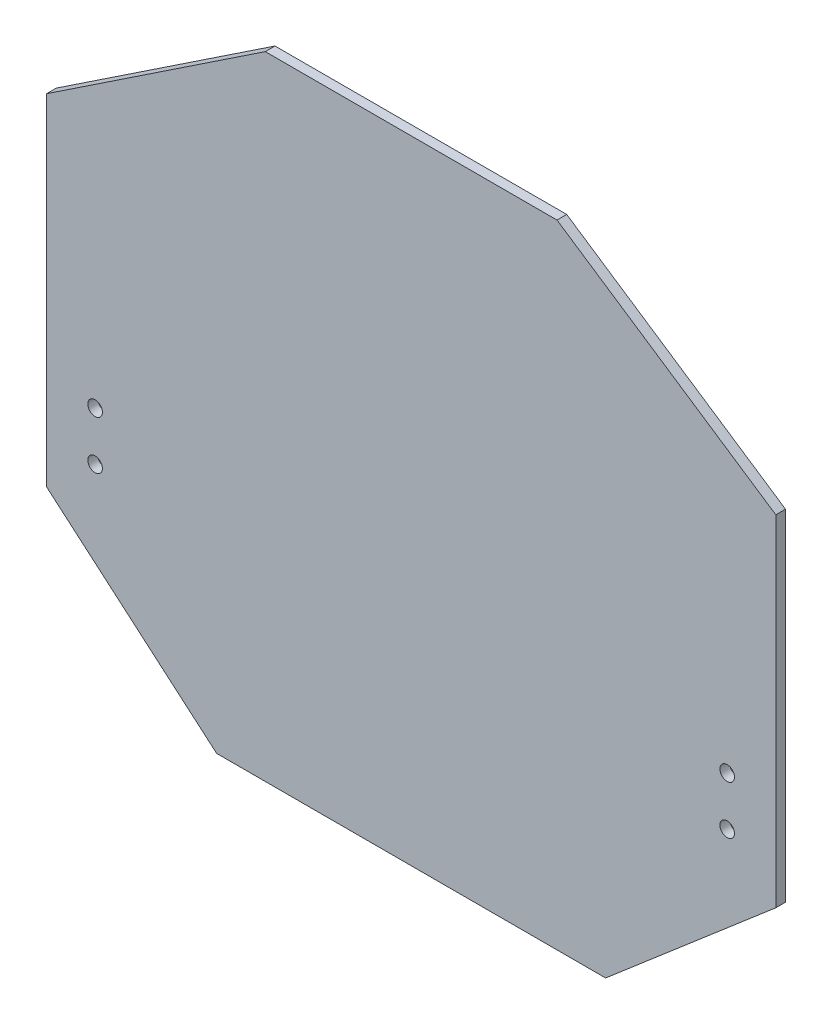
ISO-10303-21;
HEADER;
FILE_DESCRIPTION(('STEP AP214'),'2;1');
FILE_NAME('part.step','',(''),(''),'','','');
FILE_SCHEMA(('AUTOMOTIVE_DESIGN { 1 0 10303 214 1 1 1 1 }'));
ENDSEC;
DATA;
#1=APPLICATION_CONTEXT('core data for automotive mechanical design processes');
#2=APPLICATION_PROTOCOL_DEFINITION('international standard','automotive_design',2000,#1);
#3=PRODUCT_CONTEXT('',#1,'mechanical');
#4=PRODUCT('Part','Part','',(#3));
#5=PRODUCT_RELATED_PRODUCT_CATEGORY('part','',(#4));
#6=PRODUCT_DEFINITION_FORMATION('','',#4);
#7=PRODUCT_DEFINITION_CONTEXT('part definition',#1,'design');
#8=PRODUCT_DEFINITION('design','',#6,#7);
#9=PRODUCT_DEFINITION_SHAPE('','',#8);
#10=(LENGTH_UNIT() NAMED_UNIT(*) SI_UNIT(.MILLI.,.METRE.));
#11=(NAMED_UNIT(*) PLANE_ANGLE_UNIT() SI_UNIT($,.RADIAN.));
#12=(NAMED_UNIT(*) SI_UNIT($,.STERADIAN.) SOLID_ANGLE_UNIT());
#13=UNCERTAINTY_MEASURE_WITH_UNIT(LENGTH_MEASURE(1.E-05),#10,'distance_accuracy_value','');
#14=(GEOMETRIC_REPRESENTATION_CONTEXT(3) GLOBAL_UNCERTAINTY_ASSIGNED_CONTEXT((#13)) GLOBAL_UNIT_ASSIGNED_CONTEXT((#10,
#11,#12)) REPRESENTATION_CONTEXT('',''));
#15=CARTESIAN_POINT('',(0.,0.,0.));
#16=DIRECTION('',(0.,0.,1.));
#17=DIRECTION('',(1.,0.,0.));
#18=AXIS2_PLACEMENT_3D('',#15,#16,#17);
#19=CARTESIAN_POINT('',(0.,0.,2.));
#20=DIRECTION('',(0.,0.,-1.));
#21=DIRECTION('',(-1.,0.,0.));
#22=AXIS2_PLACEMENT_3D('',#19,#20,#21);
#23=PLANE('',#22);
#24=DIRECTION('',(0.759256602365296,-0.650791373455969,0.));
#25=VECTOR('',#24,1.);
#26=CARTESIAN_POINT('',(-75.,0.,2.));
#27=LINE('',#26,#25);
#28=CARTESIAN_POINT('',(-75.,0.,2.));
#29=VERTEX_POINT('',#28);
#30=CARTESIAN_POINT('',(-40.,-30.,2.));
#31=VERTEX_POINT('',#30);
#32=EDGE_CURVE('E153',#29,#31,#27,.T.);
#33=ORIENTED_EDGE('',*,*,#32,.T.);
#34=DIRECTION('',(1.,0.,0.));
#35=VECTOR('',#34,1.);
#36=CARTESIAN_POINT('',(-40.,-30.,2.));
#37=LINE('',#36,#35);
#38=CARTESIAN_POINT('',(40.,-30.,2.));
#39=VERTEX_POINT('',#38);
#40=EDGE_CURVE('E101',#31,#39,#37,.T.);
#41=ORIENTED_EDGE('',*,*,#40,.T.);
#42=DIRECTION('',(0.759256602365296,0.650791373455969,0.));
#43=VECTOR('',#42,1.);
#44=CARTESIAN_POINT('',(75.,0.,2.));
#45=LINE('',#44,#43);
#46=CARTESIAN_POINT('',(75.,0.,2.));
#47=VERTEX_POINT('',#46);
#48=EDGE_CURVE('E168',#39,#47,#45,.T.);
#49=ORIENTED_EDGE('',*,*,#48,.T.);
#50=DIRECTION('',(0.,1.,0.));
#51=VECTOR('',#50,1.);
#52=CARTESIAN_POINT('',(75.,0.,2.));
#53=LINE('',#52,#51);
#54=CARTESIAN_POINT('',(75.,70.,2.));
#55=VERTEX_POINT('',#54);
#56=EDGE_CURVE('E181',#47,#55,#53,.T.);
#57=ORIENTED_EDGE('',*,*,#56,.T.);
#58=DIRECTION('',(-0.832050294337844,0.554700196225229,0.));
#59=VECTOR('',#58,1.);
#60=CARTESIAN_POINT('',(75.,70.,2.));
#61=LINE('',#60,#59);
#62=CARTESIAN_POINT('',(30.,100.,2.));
#63=VERTEX_POINT('',#62);
#64=EDGE_CURVE('E120',#55,#63,#61,.T.);
#65=ORIENTED_EDGE('',*,*,#64,.T.);
#66=DIRECTION('',(-1.,0.,0.));
#67=VECTOR('',#66,1.);
#68=CARTESIAN_POINT('',(-30.,100.,2.));
#69=LINE('',#68,#67);
#70=CARTESIAN_POINT('',(-30.,100.,2.));
#71=VERTEX_POINT('',#70);
#72=EDGE_CURVE('E114',#63,#71,#69,.T.);
#73=ORIENTED_EDGE('',*,*,#72,.T.);
#74=DIRECTION('',(-0.832050294337844,-0.554700196225229,0.));
#75=VECTOR('',#74,1.);
#76=CARTESIAN_POINT('',(-75.,70.,2.));
#77=LINE('',#76,#75);
#78=CARTESIAN_POINT('',(-75.,70.,2.));
#79=VERTEX_POINT('',#78);
#80=EDGE_CURVE('E118',#71,#79,#77,.T.);
#81=ORIENTED_EDGE('',*,*,#80,.T.);
#82=DIRECTION('',(0.,-1.,0.));
#83=VECTOR('',#82,1.);
#84=CARTESIAN_POINT('',(-75.,0.,2.));
#85=LINE('',#84,#83);
#86=EDGE_CURVE('E58',#79,#29,#85,.T.);
#87=ORIENTED_EDGE('',*,*,#86,.T.);
#88=EDGE_LOOP('',(#33,#41,#49,#57,#65,#73,#81,#87));
#89=FACE_BOUND('',#88,.T.);
#90=CARTESIAN_POINT('',(-65.,9.,2.));
#91=DIRECTION('',(0.,0.,1.));
#92=DIRECTION('',(1.,0.,0.));
#93=AXIS2_PLACEMENT_3D('',#90,#91,#92);
#94=CIRCLE('',#93,1.5);
#95=CARTESIAN_POINT('',(-63.5,9.,2.));
#96=VERTEX_POINT('',#95);
#97=EDGE_CURVE('E142',#96,#96,#94,.T.);
#98=ORIENTED_EDGE('',*,*,#97,.F.);
#99=EDGE_LOOP('',(#98));
#100=FACE_BOUND('',#99,.T.);
#101=CARTESIAN_POINT('',(-65.,19.,2.));
#102=DIRECTION('',(0.,0.,1.));
#103=DIRECTION('',(1.,0.,0.));
#104=AXIS2_PLACEMENT_3D('',#101,#102,#103);
#105=CIRCLE('',#104,1.5);
#106=CARTESIAN_POINT('',(-63.5,19.,2.));
#107=VERTEX_POINT('',#106);
#108=EDGE_CURVE('E190',#107,#107,#105,.T.);
#109=ORIENTED_EDGE('',*,*,#108,.F.);
#110=EDGE_LOOP('',(#109));
#111=FACE_BOUND('',#110,.T.);
#112=CARTESIAN_POINT('',(65.,19.,2.));
#113=DIRECTION('',(0.,0.,1.));
#114=DIRECTION('',(-1.,0.,0.));
#115=AXIS2_PLACEMENT_3D('',#112,#113,#114);
#116=CIRCLE('',#115,1.5);
#117=CARTESIAN_POINT('',(63.5,19.,2.));
#118=VERTEX_POINT('',#117);
#119=EDGE_CURVE('E196',#118,#118,#116,.T.);
#120=ORIENTED_EDGE('',*,*,#119,.F.);
#121=EDGE_LOOP('',(#120));
#122=FACE_BOUND('',#121,.T.);
#123=CARTESIAN_POINT('',(65.,9.,2.));
#124=DIRECTION('',(0.,0.,1.));
#125=DIRECTION('',(-1.,0.,0.));
#126=AXIS2_PLACEMENT_3D('',#123,#124,#125);
#127=CIRCLE('',#126,1.5);
#128=CARTESIAN_POINT('',(63.5,9.,2.));
#129=VERTEX_POINT('',#128);
#130=EDGE_CURVE('E202',#129,#129,#127,.T.);
#131=ORIENTED_EDGE('',*,*,#130,.F.);
#132=EDGE_LOOP('',(#131));
#133=FACE_BOUND('',#132,.T.);
#134=ADVANCED_FACE('F41',(#89,#100,#111,#122,#133),#23,.F.);
#135=CARTESIAN_POINT('',(0.,0.,0.));
#136=DIRECTION('',(0.,0.,-1.));
#137=DIRECTION('',(-1.,0.,0.));
#138=AXIS2_PLACEMENT_3D('',#135,#136,#137);
#139=PLANE('',#138);
#140=CARTESIAN_POINT('',(65.,19.,0.));
#141=DIRECTION('',(0.,0.,1.));
#142=DIRECTION('',(-1.,0.,0.));
#143=AXIS2_PLACEMENT_3D('',#140,#141,#142);
#144=CIRCLE('',#143,1.5);
#145=CARTESIAN_POINT('',(63.5,19.,0.));
#146=VERTEX_POINT('',#145);
#147=EDGE_CURVE('E199',#146,#146,#144,.T.);
#148=ORIENTED_EDGE('',*,*,#147,.T.);
#149=EDGE_LOOP('',(#148));
#150=FACE_BOUND('',#149,.T.);
#151=CARTESIAN_POINT('',(-65.,9.,0.));
#152=DIRECTION('',(0.,0.,1.));
#153=DIRECTION('',(1.,0.,0.));
#154=AXIS2_PLACEMENT_3D('',#151,#152,#153);
#155=CIRCLE('',#154,1.5);
#156=CARTESIAN_POINT('',(-63.5,9.,0.));
#157=VERTEX_POINT('',#156);
#158=EDGE_CURVE('E187',#157,#157,#155,.T.);
#159=ORIENTED_EDGE('',*,*,#158,.T.);
#160=EDGE_LOOP('',(#159));
#161=FACE_BOUND('',#160,.T.);
#162=DIRECTION('',(0.759256602365296,-0.650791373455969,0.));
#163=VECTOR('',#162,1.);
#164=CARTESIAN_POINT('',(-75.,0.,0.));
#165=LINE('',#164,#163);
#166=CARTESIAN_POINT('',(-75.,0.,0.));
#167=VERTEX_POINT('',#166);
#168=CARTESIAN_POINT('',(-40.,-30.,0.));
#169=VERTEX_POINT('',#168);
#170=EDGE_CURVE('E138',#167,#169,#165,.T.);
#171=ORIENTED_EDGE('',*,*,#170,.F.);
#172=DIRECTION('',(0.,-1.,0.));
#173=VECTOR('',#172,1.);
#174=CARTESIAN_POINT('',(-75.,0.,0.));
#175=LINE('',#174,#173);
#176=CARTESIAN_POINT('',(-75.,70.,0.));
#177=VERTEX_POINT('',#176);
#178=EDGE_CURVE('E93',#177,#167,#175,.T.);
#179=ORIENTED_EDGE('',*,*,#178,.F.);
#180=DIRECTION('',(-0.832050294337844,-0.554700196225229,0.));
#181=VECTOR('',#180,1.);
#182=CARTESIAN_POINT('',(-75.,70.,0.));
#183=LINE('',#182,#181);
#184=CARTESIAN_POINT('',(-30.,100.,0.));
#185=VERTEX_POINT('',#184);
#186=EDGE_CURVE('E87',#185,#177,#183,.T.);
#187=ORIENTED_EDGE('',*,*,#186,.F.);
#188=DIRECTION('',(-1.,0.,0.));
#189=VECTOR('',#188,1.);
#190=CARTESIAN_POINT('',(-30.,100.,0.));
#191=LINE('',#190,#189);
#192=CARTESIAN_POINT('',(30.,100.,0.));
#193=VERTEX_POINT('',#192);
#194=EDGE_CURVE('E128',#193,#185,#191,.T.);
#195=ORIENTED_EDGE('',*,*,#194,.F.);
#196=DIRECTION('',(-0.832050294337844,0.554700196225229,0.));
#197=VECTOR('',#196,1.);
#198=CARTESIAN_POINT('',(75.,70.,0.));
#199=LINE('',#198,#197);
#200=CARTESIAN_POINT('',(75.,70.,0.));
#201=VERTEX_POINT('',#200);
#202=EDGE_CURVE('E148',#201,#193,#199,.T.);
#203=ORIENTED_EDGE('',*,*,#202,.F.);
#204=DIRECTION('',(0.,1.,0.));
#205=VECTOR('',#204,1.);
#206=CARTESIAN_POINT('',(75.,0.,0.));
#207=LINE('',#206,#205);
#208=CARTESIAN_POINT('',(75.,0.,0.));
#209=VERTEX_POINT('',#208);
#210=EDGE_CURVE('E146',#209,#201,#207,.T.);
#211=ORIENTED_EDGE('',*,*,#210,.F.);
#212=DIRECTION('',(0.759256602365296,0.650791373455969,0.));
#213=VECTOR('',#212,1.);
#214=CARTESIAN_POINT('',(75.,0.,0.));
#215=LINE('',#214,#213);
#216=CARTESIAN_POINT('',(40.,-30.,0.));
#217=VERTEX_POINT('',#216);
#218=EDGE_CURVE('E144',#217,#209,#215,.T.);
#219=ORIENTED_EDGE('',*,*,#218,.F.);
#220=DIRECTION('',(1.,0.,0.));
#221=VECTOR('',#220,1.);
#222=CARTESIAN_POINT('',(-40.,-30.,0.));
#223=LINE('',#222,#221);
#224=EDGE_CURVE('E141',#169,#217,#223,.T.);
#225=ORIENTED_EDGE('',*,*,#224,.F.);
#226=EDGE_LOOP('',(#171,#179,#187,#195,#203,#211,#219,#225));
#227=FACE_BOUND('',#226,.T.);
#228=CARTESIAN_POINT('',(-65.,19.,0.));
#229=DIRECTION('',(0.,0.,1.));
#230=DIRECTION('',(1.,0.,0.));
#231=AXIS2_PLACEMENT_3D('',#228,#229,#230);
#232=CIRCLE('',#231,1.5);
#233=CARTESIAN_POINT('',(-63.5,19.,0.));
#234=VERTEX_POINT('',#233);
#235=EDGE_CURVE('E193',#234,#234,#232,.T.);
#236=ORIENTED_EDGE('',*,*,#235,.T.);
#237=EDGE_LOOP('',(#236));
#238=FACE_BOUND('',#237,.T.);
#239=CARTESIAN_POINT('',(65.,9.,0.));
#240=DIRECTION('',(0.,0.,1.));
#241=DIRECTION('',(-1.,0.,0.));
#242=AXIS2_PLACEMENT_3D('',#239,#240,#241);
#243=CIRCLE('',#242,1.5);
#244=CARTESIAN_POINT('',(63.5,9.,0.));
#245=VERTEX_POINT('',#244);
#246=EDGE_CURVE('E205',#245,#245,#243,.T.);
#247=ORIENTED_EDGE('',*,*,#246,.T.);
#248=EDGE_LOOP('',(#247));
#249=FACE_BOUND('',#248,.T.);
#250=ADVANCED_FACE('F172',(#150,#161,#227,#238,#249),#139,.T.);
#251=CARTESIAN_POINT('',(-75.,0.,2.));
#252=DIRECTION('',(0.650791373455969,0.759256602365296,0.));
#253=DIRECTION('',(-0.759256602365296,0.650791373455969,0.));
#254=AXIS2_PLACEMENT_3D('',#251,#252,#253);
#255=PLANE('',#254);
#256=ORIENTED_EDGE('',*,*,#170,.T.);
#257=DIRECTION('',(0.,0.,-1.));
#258=VECTOR('',#257,1.);
#259=CARTESIAN_POINT('',(-40.,-30.,2.));
#260=LINE('',#259,#258);
#261=EDGE_CURVE('E11',#31,#169,#260,.T.);
#262=ORIENTED_EDGE('',*,*,#261,.F.);
#263=ORIENTED_EDGE('',*,*,#32,.F.);
#264=DIRECTION('',(0.,0.,-1.));
#265=VECTOR('',#264,1.);
#266=CARTESIAN_POINT('',(-75.,0.,2.));
#267=LINE('',#266,#265);
#268=EDGE_CURVE('E134',#29,#167,#267,.T.);
#269=ORIENTED_EDGE('',*,*,#268,.T.);
#270=EDGE_LOOP('',(#256,#262,#263,#269));
#271=FACE_BOUND('',#270,.T.);
#272=ADVANCED_FACE('F43',(#271),#255,.F.);
#273=CARTESIAN_POINT('',(-40.,-30.,2.));
#274=DIRECTION('',(0.,1.,0.));
#275=DIRECTION('',(0.,0.,1.));
#276=AXIS2_PLACEMENT_3D('',#273,#274,#275);
#277=PLANE('',#276);
#278=ORIENTED_EDGE('',*,*,#224,.T.);
#279=DIRECTION('',(0.,0.,-1.));
#280=VECTOR('',#279,1.);
#281=CARTESIAN_POINT('',(40.,-30.,2.));
#282=LINE('',#281,#280);
#283=EDGE_CURVE('E50',#39,#217,#282,.T.);
#284=ORIENTED_EDGE('',*,*,#283,.F.);
#285=ORIENTED_EDGE('',*,*,#40,.F.);
#286=ORIENTED_EDGE('',*,*,#261,.T.);
#287=EDGE_LOOP('',(#278,#284,#285,#286));
#288=FACE_BOUND('',#287,.T.);
#289=ADVANCED_FACE('F237',(#288),#277,.F.);
#290=CARTESIAN_POINT('',(75.,0.,2.));
#291=DIRECTION('',(-0.650791373455969,0.759256602365296,0.));
#292=DIRECTION('',(-0.759256602365296,-0.650791373455969,0.));
#293=AXIS2_PLACEMENT_3D('',#290,#291,#292);
#294=PLANE('',#293);
#295=ORIENTED_EDGE('',*,*,#218,.T.);
#296=DIRECTION('',(0.,0.,-1.));
#297=VECTOR('',#296,1.);
#298=CARTESIAN_POINT('',(75.,0.,2.));
#299=LINE('',#298,#297);
#300=EDGE_CURVE('E160',#47,#209,#299,.T.);
#301=ORIENTED_EDGE('',*,*,#300,.F.);
#302=ORIENTED_EDGE('',*,*,#48,.F.);
#303=ORIENTED_EDGE('',*,*,#283,.T.);
#304=EDGE_LOOP('',(#295,#301,#302,#303));
#305=FACE_BOUND('',#304,.T.);
#306=ADVANCED_FACE('F166',(#305),#294,.F.);
#307=CARTESIAN_POINT('',(75.,0.,2.));
#308=DIRECTION('',(-1.,0.,0.));
#309=DIRECTION('',(0.,0.,1.));
#310=AXIS2_PLACEMENT_3D('',#307,#308,#309);
#311=PLANE('',#310);
#312=ORIENTED_EDGE('',*,*,#210,.T.);
#313=DIRECTION('',(0.,0.,-1.));
#314=VECTOR('',#313,1.);
#315=CARTESIAN_POINT('',(75.,70.,2.));
#316=LINE('',#315,#314);
#317=EDGE_CURVE('E157',#55,#201,#316,.T.);
#318=ORIENTED_EDGE('',*,*,#317,.F.);
#319=ORIENTED_EDGE('',*,*,#56,.F.);
#320=ORIENTED_EDGE('',*,*,#300,.T.);
#321=EDGE_LOOP('',(#312,#318,#319,#320));
#322=FACE_BOUND('',#321,.T.);
#323=ADVANCED_FACE('F177',(#322),#311,.F.);
#324=CARTESIAN_POINT('',(75.,70.,2.));
#325=DIRECTION('',(-0.554700196225229,-0.832050294337843,0.));
#326=DIRECTION('',(0.832050294337844,-0.554700196225229,0.));
#327=AXIS2_PLACEMENT_3D('',#324,#325,#326);
#328=PLANE('',#327);
#329=ORIENTED_EDGE('',*,*,#202,.T.);
#330=DIRECTION('',(0.,0.,-1.));
#331=VECTOR('',#330,1.);
#332=CARTESIAN_POINT('',(30.,100.,2.));
#333=LINE('',#332,#331);
#334=EDGE_CURVE('E129',#63,#193,#333,.T.);
#335=ORIENTED_EDGE('',*,*,#334,.F.);
#336=ORIENTED_EDGE('',*,*,#64,.F.);
#337=ORIENTED_EDGE('',*,*,#317,.T.);
#338=EDGE_LOOP('',(#329,#335,#336,#337));
#339=FACE_BOUND('',#338,.T.);
#340=ADVANCED_FACE('F180',(#339),#328,.F.);
#341=CARTESIAN_POINT('',(-30.,100.,2.));
#342=DIRECTION('',(0.,-1.,0.));
#343=DIRECTION('',(0.,0.,-1.));
#344=AXIS2_PLACEMENT_3D('',#341,#342,#343);
#345=PLANE('',#344);
#346=ORIENTED_EDGE('',*,*,#194,.T.);
#347=DIRECTION('',(0.,0.,-1.));
#348=VECTOR('',#347,1.);
#349=CARTESIAN_POINT('',(-30.,100.,2.));
#350=LINE('',#349,#348);
#351=EDGE_CURVE('E125',#71,#185,#350,.T.);
#352=ORIENTED_EDGE('',*,*,#351,.F.);
#353=ORIENTED_EDGE('',*,*,#72,.F.);
#354=ORIENTED_EDGE('',*,*,#334,.T.);
#355=EDGE_LOOP('',(#346,#352,#353,#354));
#356=FACE_BOUND('',#355,.T.);
#357=ADVANCED_FACE('F126',(#356),#345,.F.);
#358=CARTESIAN_POINT('',(-75.,70.,2.));
#359=DIRECTION('',(0.554700196225229,-0.832050294337843,0.));
#360=DIRECTION('',(0.832050294337844,0.554700196225229,0.));
#361=AXIS2_PLACEMENT_3D('',#358,#359,#360);
#362=PLANE('',#361);
#363=ORIENTED_EDGE('',*,*,#186,.T.);
#364=DIRECTION('',(0.,0.,-1.));
#365=VECTOR('',#364,1.);
#366=CARTESIAN_POINT('',(-75.,70.,2.));
#367=LINE('',#366,#365);
#368=EDGE_CURVE('E130',#79,#177,#367,.T.);
#369=ORIENTED_EDGE('',*,*,#368,.F.);
#370=ORIENTED_EDGE('',*,*,#80,.F.);
#371=ORIENTED_EDGE('',*,*,#351,.T.);
#372=EDGE_LOOP('',(#363,#369,#370,#371));
#373=FACE_BOUND('',#372,.T.);
#374=ADVANCED_FACE('F132',(#373),#362,.F.);
#375=CARTESIAN_POINT('',(-75.,0.,2.));
#376=DIRECTION('',(1.,0.,0.));
#377=DIRECTION('',(0.,0.,-1.));
#378=AXIS2_PLACEMENT_3D('',#375,#376,#377);
#379=PLANE('',#378);
#380=ORIENTED_EDGE('',*,*,#178,.T.);
#381=ORIENTED_EDGE('',*,*,#268,.F.);
#382=ORIENTED_EDGE('',*,*,#86,.F.);
#383=ORIENTED_EDGE('',*,*,#368,.T.);
#384=EDGE_LOOP('',(#380,#381,#382,#383));
#385=FACE_BOUND('',#384,.T.);
#386=ADVANCED_FACE('F225',(#385),#379,.F.);
#387=CARTESIAN_POINT('',(-65.,9.,2.));
#388=DIRECTION('',(0.,0.,-1.));
#389=DIRECTION('',(-1.,0.,0.));
#390=AXIS2_PLACEMENT_3D('',#387,#388,#389);
#391=CYLINDRICAL_SURFACE('',#390,1.5);
#392=ORIENTED_EDGE('',*,*,#97,.T.);
#393=EDGE_LOOP('',(#392));
#394=FACE_BOUND('',#393,.T.);
#395=ORIENTED_EDGE('',*,*,#158,.F.);
#396=EDGE_LOOP('',(#395));
#397=FACE_BOUND('',#396,.T.);
#398=ADVANCED_FACE('F222',(#394,#397),#391,.F.);
#399=CARTESIAN_POINT('',(-65.,19.,2.));
#400=DIRECTION('',(0.,0.,-1.));
#401=DIRECTION('',(-1.,0.,0.));
#402=AXIS2_PLACEMENT_3D('',#399,#400,#401);
#403=CYLINDRICAL_SURFACE('',#402,1.5);
#404=ORIENTED_EDGE('',*,*,#108,.T.);
#405=EDGE_LOOP('',(#404));
#406=FACE_BOUND('',#405,.T.);
#407=ORIENTED_EDGE('',*,*,#235,.F.);
#408=EDGE_LOOP('',(#407));
#409=FACE_BOUND('',#408,.T.);
#410=ADVANCED_FACE('F300',(#406,#409),#403,.F.);
#411=CARTESIAN_POINT('',(65.,19.,2.));
#412=DIRECTION('',(0.,0.,-1.));
#413=DIRECTION('',(-1.,0.,0.));
#414=AXIS2_PLACEMENT_3D('',#411,#412,#413);
#415=CYLINDRICAL_SURFACE('',#414,1.5);
#416=ORIENTED_EDGE('',*,*,#119,.T.);
#417=EDGE_LOOP('',(#416));
#418=FACE_BOUND('',#417,.T.);
#419=ORIENTED_EDGE('',*,*,#147,.F.);
#420=EDGE_LOOP('',(#419));
#421=FACE_BOUND('',#420,.T.);
#422=ADVANCED_FACE('F308',(#418,#421),#415,.F.);
#423=CARTESIAN_POINT('',(65.,9.,2.));
#424=DIRECTION('',(0.,0.,-1.));
#425=DIRECTION('',(-1.,0.,0.));
#426=AXIS2_PLACEMENT_3D('',#423,#424,#425);
#427=CYLINDRICAL_SURFACE('',#426,1.5);
#428=ORIENTED_EDGE('',*,*,#130,.T.);
#429=EDGE_LOOP('',(#428));
#430=FACE_BOUND('',#429,.T.);
#431=ORIENTED_EDGE('',*,*,#246,.F.);
#432=EDGE_LOOP('',(#431));
#433=FACE_BOUND('',#432,.T.);
#434=ADVANCED_FACE('F211',(#430,#433),#427,.F.);
#435=CLOSED_SHELL('',(#134,#250,#272,#289,#306,#323,#340,#357,#374,#386,#398,#410,#422,#434));
#436=MANIFOLD_SOLID_BREP('B2',#435);
#437=ADVANCED_BREP_SHAPE_REPRESENTATION('',(#18,#436),#14);
#438=SHAPE_DEFINITION_REPRESENTATION(#9,#437);
ENDSEC;
END-ISO-10303-21;
